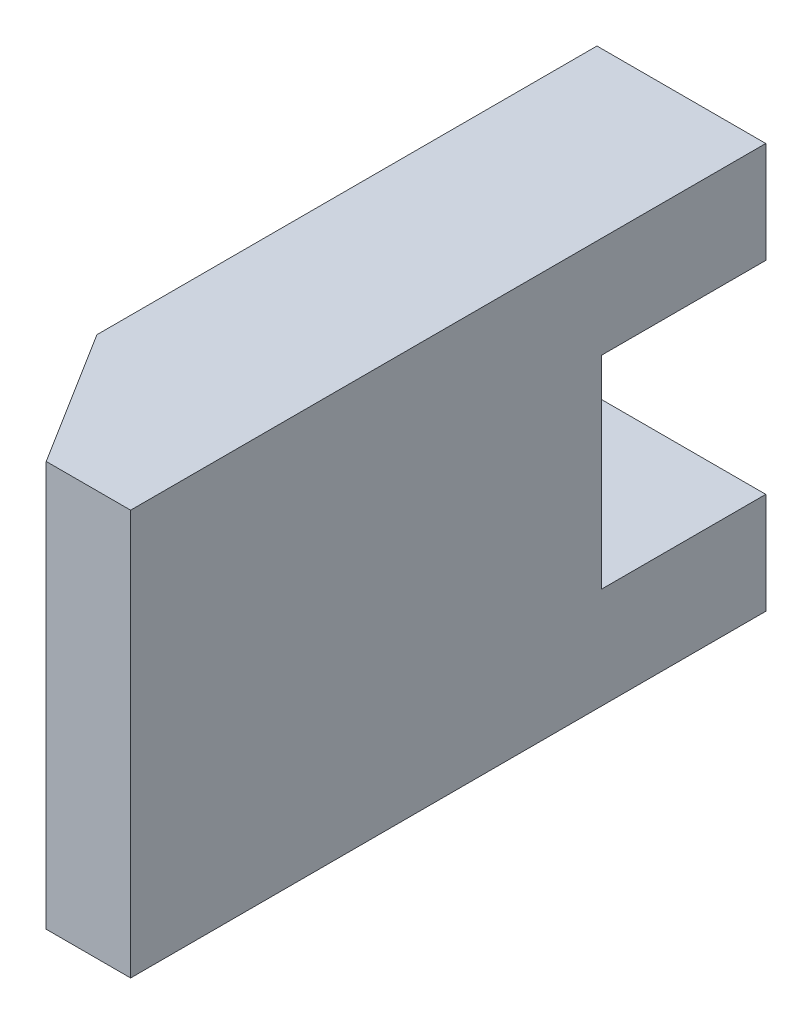
ISO-10303-21;
HEADER;
FILE_DESCRIPTION(('STEP AP214'),'2;1');
FILE_NAME('part.step','',(''),(''),'','','');
FILE_SCHEMA(('AUTOMOTIVE_DESIGN { 1 0 10303 214 1 1 1 1 }'));
ENDSEC;
DATA;
#1=APPLICATION_CONTEXT('core data for automotive mechanical design processes');
#2=APPLICATION_PROTOCOL_DEFINITION('international standard','automotive_design',2000,#1);
#3=PRODUCT_CONTEXT('',#1,'mechanical');
#4=PRODUCT('Part','Part','',(#3));
#5=PRODUCT_RELATED_PRODUCT_CATEGORY('part','',(#4));
#6=PRODUCT_DEFINITION_FORMATION('','',#4);
#7=PRODUCT_DEFINITION_CONTEXT('part definition',#1,'design');
#8=PRODUCT_DEFINITION('design','',#6,#7);
#9=PRODUCT_DEFINITION_SHAPE('','',#8);
#10=(LENGTH_UNIT() NAMED_UNIT(*) SI_UNIT(.MILLI.,.METRE.));
#11=(NAMED_UNIT(*) PLANE_ANGLE_UNIT() SI_UNIT($,.RADIAN.));
#12=(NAMED_UNIT(*) SI_UNIT($,.STERADIAN.) SOLID_ANGLE_UNIT());
#13=UNCERTAINTY_MEASURE_WITH_UNIT(LENGTH_MEASURE(1.E-05),#10,'distance_accuracy_value','');
#14=(GEOMETRIC_REPRESENTATION_CONTEXT(3) GLOBAL_UNCERTAINTY_ASSIGNED_CONTEXT((#13)) GLOBAL_UNIT_ASSIGNED_CONTEXT((#10,
#11,#12)) REPRESENTATION_CONTEXT('',''));
#15=CARTESIAN_POINT('',(0.,0.,0.));
#16=DIRECTION('',(0.,0.,1.));
#17=DIRECTION('',(1.,0.,0.));
#18=AXIS2_PLACEMENT_3D('',#15,#16,#17);
#19=CARTESIAN_POINT('',(5.,-6.,-18.8123640016166));
#20=DIRECTION('',(0.,1.,0.));
#21=DIRECTION('',(0.,0.,1.));
#22=AXIS2_PLACEMENT_3D('',#19,#20,#21);
#23=PLANE('',#22);
#24=DIRECTION('',(0.52999894000318,0.,0.847998304005088));
#25=VECTOR('',#24,1.);
#26=CARTESIAN_POINT('',(1.79775280898876,-6.,-1.12359550561798));
#27=LINE('',#26,#25);
#28=CARTESIAN_POINT('',(0.,-6.,-4.));
#29=VERTEX_POINT('',#28);
#30=CARTESIAN_POINT('',(2.5,-6.,0.));
#31=VERTEX_POINT('',#30);
#32=EDGE_CURVE('E183',#29,#31,#27,.T.);
#33=ORIENTED_EDGE('',*,*,#32,.F.);
#34=DIRECTION('',(0.,0.,-1.));
#35=VECTOR('',#34,1.);
#36=CARTESIAN_POINT('',(0.,-6.,-18.8123640016166));
#37=LINE('',#36,#35);
#38=CARTESIAN_POINT('',(0.,-6.,-18.8123640016166));
#39=VERTEX_POINT('',#38);
#40=EDGE_CURVE('E132',#29,#39,#37,.T.);
#41=ORIENTED_EDGE('',*,*,#40,.T.);
#42=DIRECTION('',(-1.,0.,0.));
#43=VECTOR('',#42,1.);
#44=CARTESIAN_POINT('',(5.,-6.,-18.8123640016166));
#45=LINE('',#44,#43);
#46=CARTESIAN_POINT('',(5.,-6.,-18.8123640016166));
#47=VERTEX_POINT('',#46);
#48=EDGE_CURVE('E11',#47,#39,#45,.T.);
#49=ORIENTED_EDGE('',*,*,#48,.F.);
#50=DIRECTION('',(0.,0.,-1.));
#51=VECTOR('',#50,1.);
#52=CARTESIAN_POINT('',(5.,-6.,-18.8123640016166));
#53=LINE('',#52,#51);
#54=CARTESIAN_POINT('',(5.,-6.,0.));
#55=VERTEX_POINT('',#54);
#56=EDGE_CURVE('E146',#55,#47,#53,.T.);
#57=ORIENTED_EDGE('',*,*,#56,.F.);
#58=DIRECTION('',(-1.,0.,0.));
#59=VECTOR('',#58,1.);
#60=CARTESIAN_POINT('',(5.,-6.,0.));
#61=LINE('',#60,#59);
#62=EDGE_CURVE('E128',#55,#31,#61,.T.);
#63=ORIENTED_EDGE('',*,*,#62,.T.);
#64=EDGE_LOOP('',(#33,#41,#49,#57,#63));
#65=FACE_BOUND('',#64,.T.);
#66=ADVANCED_FACE('F33',(#65),#23,.F.);
#67=CARTESIAN_POINT('',(5.,6.,0.));
#68=DIRECTION('',(0.,-1.,0.));
#69=DIRECTION('',(0.,0.,-1.));
#70=AXIS2_PLACEMENT_3D('',#67,#68,#69);
#71=PLANE('',#70);
#72=DIRECTION('',(0.52999894000318,0.,0.847998304005088));
#73=VECTOR('',#72,1.);
#74=CARTESIAN_POINT('',(1.79775280898876,6.,-1.12359550561798));
#75=LINE('',#74,#73);
#76=CARTESIAN_POINT('',(0.,6.,-4.));
#77=VERTEX_POINT('',#76);
#78=CARTESIAN_POINT('',(2.5,6.,0.));
#79=VERTEX_POINT('',#78);
#80=EDGE_CURVE('E47',#77,#79,#75,.T.);
#81=ORIENTED_EDGE('',*,*,#80,.T.);
#82=DIRECTION('',(-1.,0.,0.));
#83=VECTOR('',#82,1.);
#84=CARTESIAN_POINT('',(5.,6.,0.));
#85=LINE('',#84,#83);
#86=CARTESIAN_POINT('',(5.,6.,0.));
#87=VERTEX_POINT('',#86);
#88=EDGE_CURVE('E123',#87,#79,#85,.T.);
#89=ORIENTED_EDGE('',*,*,#88,.F.);
#90=DIRECTION('',(0.,0.,1.));
#91=VECTOR('',#90,1.);
#92=CARTESIAN_POINT('',(5.,6.,0.));
#93=LINE('',#92,#91);
#94=CARTESIAN_POINT('',(5.,6.,-18.8123640016166));
#95=VERTEX_POINT('',#94);
#96=EDGE_CURVE('E111',#95,#87,#93,.T.);
#97=ORIENTED_EDGE('',*,*,#96,.F.);
#98=DIRECTION('',(-1.,0.,0.));
#99=VECTOR('',#98,1.);
#100=CARTESIAN_POINT('',(5.,6.,-18.8123640016166));
#101=LINE('',#100,#99);
#102=CARTESIAN_POINT('',(0.,6.,-18.8123640016166));
#103=VERTEX_POINT('',#102);
#104=EDGE_CURVE('E117',#95,#103,#101,.T.);
#105=ORIENTED_EDGE('',*,*,#104,.T.);
#106=DIRECTION('',(0.,0.,1.));
#107=VECTOR('',#106,1.);
#108=CARTESIAN_POINT('',(0.,6.,0.));
#109=LINE('',#108,#107);
#110=EDGE_CURVE('E144',#103,#77,#109,.T.);
#111=ORIENTED_EDGE('',*,*,#110,.T.);
#112=EDGE_LOOP('',(#81,#89,#97,#105,#111));
#113=FACE_BOUND('',#112,.T.);
#114=ADVANCED_FACE('F125',(#113),#71,.F.);
#115=CARTESIAN_POINT('',(5.,6.,0.));
#116=DIRECTION('',(0.,0.,-1.));
#117=DIRECTION('',(-1.,0.,0.));
#118=AXIS2_PLACEMENT_3D('',#115,#116,#117);
#119=PLANE('',#118);
#120=DIRECTION('',(0.,1.,0.));
#121=VECTOR('',#120,1.);
#122=CARTESIAN_POINT('',(2.5,-6.,0.));
#123=LINE('',#122,#121);
#124=EDGE_CURVE('E135',#31,#79,#123,.T.);
#125=ORIENTED_EDGE('',*,*,#124,.F.);
#126=ORIENTED_EDGE('',*,*,#62,.F.);
#127=DIRECTION('',(0.,-1.,0.));
#128=VECTOR('',#127,1.);
#129=CARTESIAN_POINT('',(5.,6.,0.));
#130=LINE('',#129,#128);
#131=EDGE_CURVE('E56',#87,#55,#130,.T.);
#132=ORIENTED_EDGE('',*,*,#131,.F.);
#133=ORIENTED_EDGE('',*,*,#88,.T.);
#134=EDGE_LOOP('',(#125,#126,#132,#133));
#135=FACE_BOUND('',#134,.T.);
#136=ADVANCED_FACE('F193',(#135),#119,.F.);
#137=CARTESIAN_POINT('',(0.,0.,0.));
#138=DIRECTION('',(1.,0.,0.));
#139=DIRECTION('',(0.,0.,-1.));
#140=AXIS2_PLACEMENT_3D('',#137,#138,#139);
#141=PLANE('',#140);
#142=DIRECTION('',(0.,1.,0.));
#143=VECTOR('',#142,1.);
#144=CARTESIAN_POINT('',(0.,-6.,-4.));
#145=LINE('',#144,#143);
#146=EDGE_CURVE('E181',#29,#77,#145,.T.);
#147=ORIENTED_EDGE('',*,*,#146,.T.);
#148=ORIENTED_EDGE('',*,*,#110,.F.);
#149=DIRECTION('',(0.,1.,0.));
#150=VECTOR('',#149,1.);
#151=CARTESIAN_POINT('',(0.,6.,-18.8123640016166));
#152=LINE('',#151,#150);
#153=CARTESIAN_POINT('',(0.,3.,-18.8123640016166));
#154=VERTEX_POINT('',#153);
#155=EDGE_CURVE('E84',#154,#103,#152,.T.);
#156=ORIENTED_EDGE('',*,*,#155,.F.);
#157=DIRECTION('',(0.,0.,-1.));
#158=VECTOR('',#157,1.);
#159=CARTESIAN_POINT('',(0.,3.,-18.8123640016166));
#160=LINE('',#159,#158);
#161=CARTESIAN_POINT('',(0.,3.,-13.9500868796583));
#162=VERTEX_POINT('',#161);
#163=EDGE_CURVE('E141',#162,#154,#160,.T.);
#164=ORIENTED_EDGE('',*,*,#163,.F.);
#165=DIRECTION('',(0.,1.,0.));
#166=VECTOR('',#165,1.);
#167=CARTESIAN_POINT('',(0.,3.,-13.9500868796583));
#168=LINE('',#167,#166);
#169=CARTESIAN_POINT('',(0.,-3.,-13.9500868796583));
#170=VERTEX_POINT('',#169);
#171=EDGE_CURVE('E139',#170,#162,#168,.T.);
#172=ORIENTED_EDGE('',*,*,#171,.F.);
#173=DIRECTION('',(0.,0.,1.));
#174=VECTOR('',#173,1.);
#175=CARTESIAN_POINT('',(0.,-3.,-13.9500868796583));
#176=LINE('',#175,#174);
#177=CARTESIAN_POINT('',(0.,-3.,-18.8123640016166));
#178=VERTEX_POINT('',#177);
#179=EDGE_CURVE('E137',#178,#170,#176,.T.);
#180=ORIENTED_EDGE('',*,*,#179,.F.);
#181=DIRECTION('',(0.,1.,0.));
#182=VECTOR('',#181,1.);
#183=CARTESIAN_POINT('',(0.,-3.,-18.8123640016166));
#184=LINE('',#183,#182);
#185=EDGE_CURVE('E134',#39,#178,#184,.T.);
#186=ORIENTED_EDGE('',*,*,#185,.F.);
#187=ORIENTED_EDGE('',*,*,#40,.F.);
#188=EDGE_LOOP('',(#147,#148,#156,#164,#172,#180,#186,#187));
#189=FACE_BOUND('',#188,.T.);
#190=ADVANCED_FACE('F166',(#189),#141,.F.);
#191=CARTESIAN_POINT('',(5.,-3.,-18.8123640016166));
#192=DIRECTION('',(0.,0.,1.));
#193=DIRECTION('',(1.,0.,0.));
#194=AXIS2_PLACEMENT_3D('',#191,#192,#193);
#195=PLANE('',#194);
#196=ORIENTED_EDGE('',*,*,#185,.T.);
#197=DIRECTION('',(-1.,0.,0.));
#198=VECTOR('',#197,1.);
#199=CARTESIAN_POINT('',(5.,-3.,-18.8123640016166));
#200=LINE('',#199,#198);
#201=CARTESIAN_POINT('',(5.,-3.,-18.8123640016166));
#202=VERTEX_POINT('',#201);
#203=EDGE_CURVE('E40',#202,#178,#200,.T.);
#204=ORIENTED_EDGE('',*,*,#203,.F.);
#205=DIRECTION('',(0.,1.,0.));
#206=VECTOR('',#205,1.);
#207=CARTESIAN_POINT('',(5.,-3.,-18.8123640016166));
#208=LINE('',#207,#206);
#209=EDGE_CURVE('E92',#47,#202,#208,.T.);
#210=ORIENTED_EDGE('',*,*,#209,.F.);
#211=ORIENTED_EDGE('',*,*,#48,.T.);
#212=EDGE_LOOP('',(#196,#204,#210,#211));
#213=FACE_BOUND('',#212,.T.);
#214=ADVANCED_FACE('F196',(#213),#195,.F.);
#215=CARTESIAN_POINT('',(5.,-3.,-13.9500868796583));
#216=DIRECTION('',(0.,-1.,0.));
#217=DIRECTION('',(0.,0.,-1.));
#218=AXIS2_PLACEMENT_3D('',#215,#216,#217);
#219=PLANE('',#218);
#220=ORIENTED_EDGE('',*,*,#179,.T.);
#221=DIRECTION('',(-1.,0.,0.));
#222=VECTOR('',#221,1.);
#223=CARTESIAN_POINT('',(5.,-3.,-13.9500868796583));
#224=LINE('',#223,#222);
#225=CARTESIAN_POINT('',(5.,-3.,-13.9500868796583));
#226=VERTEX_POINT('',#225);
#227=EDGE_CURVE('E154',#226,#170,#224,.T.);
#228=ORIENTED_EDGE('',*,*,#227,.F.);
#229=DIRECTION('',(0.,0.,1.));
#230=VECTOR('',#229,1.);
#231=CARTESIAN_POINT('',(5.,-3.,-13.9500868796583));
#232=LINE('',#231,#230);
#233=EDGE_CURVE('E162',#202,#226,#232,.T.);
#234=ORIENTED_EDGE('',*,*,#233,.F.);
#235=ORIENTED_EDGE('',*,*,#203,.T.);
#236=EDGE_LOOP('',(#220,#228,#234,#235));
#237=FACE_BOUND('',#236,.T.);
#238=ADVANCED_FACE('F160',(#237),#219,.F.);
#239=CARTESIAN_POINT('',(5.,3.,-13.9500868796583));
#240=DIRECTION('',(0.,0.,1.));
#241=DIRECTION('',(1.,0.,0.));
#242=AXIS2_PLACEMENT_3D('',#239,#240,#241);
#243=PLANE('',#242);
#244=ORIENTED_EDGE('',*,*,#171,.T.);
#245=DIRECTION('',(-1.,0.,0.));
#246=VECTOR('',#245,1.);
#247=CARTESIAN_POINT('',(5.,3.,-13.9500868796583));
#248=LINE('',#247,#246);
#249=CARTESIAN_POINT('',(5.,3.,-13.9500868796583));
#250=VERTEX_POINT('',#249);
#251=EDGE_CURVE('E151',#250,#162,#248,.T.);
#252=ORIENTED_EDGE('',*,*,#251,.F.);
#253=DIRECTION('',(0.,1.,0.));
#254=VECTOR('',#253,1.);
#255=CARTESIAN_POINT('',(5.,3.,-13.9500868796583));
#256=LINE('',#255,#254);
#257=EDGE_CURVE('E175',#226,#250,#256,.T.);
#258=ORIENTED_EDGE('',*,*,#257,.F.);
#259=ORIENTED_EDGE('',*,*,#227,.T.);
#260=EDGE_LOOP('',(#244,#252,#258,#259));
#261=FACE_BOUND('',#260,.T.);
#262=ADVANCED_FACE('F171',(#261),#243,.F.);
#263=CARTESIAN_POINT('',(5.,3.,-18.8123640016166));
#264=DIRECTION('',(0.,1.,0.));
#265=DIRECTION('',(0.,0.,1.));
#266=AXIS2_PLACEMENT_3D('',#263,#264,#265);
#267=PLANE('',#266);
#268=ORIENTED_EDGE('',*,*,#163,.T.);
#269=DIRECTION('',(-1.,0.,0.));
#270=VECTOR('',#269,1.);
#271=CARTESIAN_POINT('',(5.,3.,-18.8123640016166));
#272=LINE('',#271,#270);
#273=CARTESIAN_POINT('',(5.,3.,-18.8123640016166));
#274=VERTEX_POINT('',#273);
#275=EDGE_CURVE('E122',#274,#154,#272,.T.);
#276=ORIENTED_EDGE('',*,*,#275,.F.);
#277=DIRECTION('',(0.,0.,-1.));
#278=VECTOR('',#277,1.);
#279=CARTESIAN_POINT('',(5.,3.,-18.8123640016166));
#280=LINE('',#279,#278);
#281=EDGE_CURVE('E114',#250,#274,#280,.T.);
#282=ORIENTED_EDGE('',*,*,#281,.F.);
#283=ORIENTED_EDGE('',*,*,#251,.T.);
#284=EDGE_LOOP('',(#268,#276,#282,#283));
#285=FACE_BOUND('',#284,.T.);
#286=ADVANCED_FACE('F174',(#285),#267,.F.);
#287=CARTESIAN_POINT('',(5.,6.,-18.8123640016166));
#288=DIRECTION('',(0.,0.,1.));
#289=DIRECTION('',(1.,0.,0.));
#290=AXIS2_PLACEMENT_3D('',#287,#288,#289);
#291=PLANE('',#290);
#292=ORIENTED_EDGE('',*,*,#155,.T.);
#293=ORIENTED_EDGE('',*,*,#104,.F.);
#294=DIRECTION('',(0.,1.,0.));
#295=VECTOR('',#294,1.);
#296=CARTESIAN_POINT('',(5.,6.,-18.8123640016166));
#297=LINE('',#296,#295);
#298=EDGE_CURVE('E108',#274,#95,#297,.T.);
#299=ORIENTED_EDGE('',*,*,#298,.F.);
#300=ORIENTED_EDGE('',*,*,#275,.T.);
#301=EDGE_LOOP('',(#292,#293,#299,#300));
#302=FACE_BOUND('',#301,.T.);
#303=ADVANCED_FACE('F118',(#302),#291,.F.);
#304=CARTESIAN_POINT('',(5.,0.,0.));
#305=DIRECTION('',(1.,0.,0.));
#306=DIRECTION('',(0.,0.,-1.));
#307=AXIS2_PLACEMENT_3D('',#304,#305,#306);
#308=PLANE('',#307);
#309=ORIENTED_EDGE('',*,*,#56,.T.);
#310=ORIENTED_EDGE('',*,*,#209,.T.);
#311=ORIENTED_EDGE('',*,*,#233,.T.);
#312=ORIENTED_EDGE('',*,*,#257,.T.);
#313=ORIENTED_EDGE('',*,*,#281,.T.);
#314=ORIENTED_EDGE('',*,*,#298,.T.);
#315=ORIENTED_EDGE('',*,*,#96,.T.);
#316=ORIENTED_EDGE('',*,*,#131,.T.);
#317=EDGE_LOOP('',(#309,#310,#311,#312,#313,#314,#315,#316));
#318=FACE_BOUND('',#317,.T.);
#319=ADVANCED_FACE('F109',(#318),#308,.T.);
#320=CARTESIAN_POINT('',(1.79775280898876,-6.,-1.12359550561798));
#321=DIRECTION('',(-0.847998304005088,0.,0.52999894000318));
#322=DIRECTION('',(0.52999894000318,0.,0.847998304005088));
#323=AXIS2_PLACEMENT_3D('',#320,#321,#322);
#324=PLANE('',#323);
#325=ORIENTED_EDGE('',*,*,#80,.F.);
#326=ORIENTED_EDGE('',*,*,#146,.F.);
#327=ORIENTED_EDGE('',*,*,#32,.T.);
#328=ORIENTED_EDGE('',*,*,#124,.T.);
#329=EDGE_LOOP('',(#325,#326,#327,#328));
#330=FACE_BOUND('',#329,.T.);
#331=ADVANCED_FACE('F189',(#330),#324,.T.);
#332=CLOSED_SHELL('',(#66,#114,#136,#190,#214,#238,#262,#286,#303,#319,#331));
#333=MANIFOLD_SOLID_BREP('B2',#332);
#334=ADVANCED_BREP_SHAPE_REPRESENTATION('',(#18,#333),#14);
#335=SHAPE_DEFINITION_REPRESENTATION(#9,#334);
ENDSEC;
END-ISO-10303-21;
